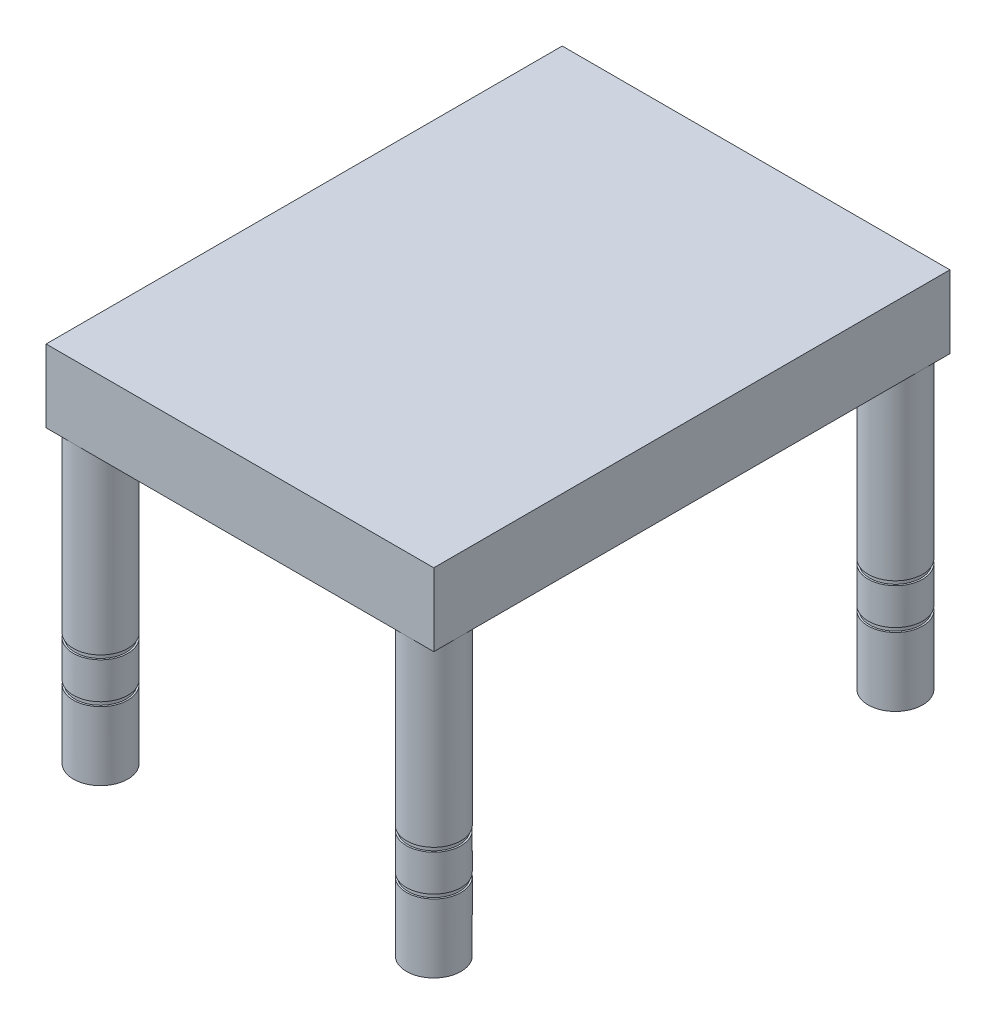
ISO-10303-21;
HEADER;
FILE_DESCRIPTION(('STEP AP214'),'2;1');
FILE_NAME('part.step','',(''),(''),'','','');
FILE_SCHEMA(('AUTOMOTIVE_DESIGN { 1 0 10303 214 1 1 1 1 }'));
ENDSEC;
DATA;
#1=APPLICATION_CONTEXT('core data for automotive mechanical design processes');
#2=APPLICATION_PROTOCOL_DEFINITION('international standard','automotive_design',2000,#1);
#3=PRODUCT_CONTEXT('',#1,'mechanical');
#4=PRODUCT('Part','Part','',(#3));
#5=PRODUCT_RELATED_PRODUCT_CATEGORY('part','',(#4));
#6=PRODUCT_DEFINITION_FORMATION('','',#4);
#7=PRODUCT_DEFINITION_CONTEXT('part definition',#1,'design');
#8=PRODUCT_DEFINITION('design','',#6,#7);
#9=PRODUCT_DEFINITION_SHAPE('','',#8);
#10=(LENGTH_UNIT() NAMED_UNIT(*) SI_UNIT(.MILLI.,.METRE.));
#11=(NAMED_UNIT(*) PLANE_ANGLE_UNIT() SI_UNIT($,.RADIAN.));
#12=(NAMED_UNIT(*) SI_UNIT($,.STERADIAN.) SOLID_ANGLE_UNIT());
#13=UNCERTAINTY_MEASURE_WITH_UNIT(LENGTH_MEASURE(1.E-05),#10,'distance_accuracy_value','');
#14=(GEOMETRIC_REPRESENTATION_CONTEXT(3) GLOBAL_UNCERTAINTY_ASSIGNED_CONTEXT((#13)) GLOBAL_UNIT_ASSIGNED_CONTEXT((#10,
#11,#12)) REPRESENTATION_CONTEXT('',''));
#15=CARTESIAN_POINT('',(0.,0.,0.));
#16=DIRECTION('',(0.,0.,1.));
#17=DIRECTION('',(1.,0.,0.));
#18=AXIS2_PLACEMENT_3D('',#15,#16,#17);
#19=CARTESIAN_POINT('',(0.,63.5,0.));
#20=DIRECTION('',(0.,1.,0.));
#21=DIRECTION('',(0.,0.,1.));
#22=AXIS2_PLACEMENT_3D('',#19,#20,#21);
#23=PLANE('',#22);
#24=DIRECTION('',(0.,0.,1.));
#25=VECTOR('',#24,1.);
#26=CARTESIAN_POINT('',(-33.8824951,63.5,-45.1092443));
#27=LINE('',#26,#25);
#28=CARTESIAN_POINT('',(-33.8824951,63.5,-45.1092443));
#29=VERTEX_POINT('',#28);
#30=CARTESIAN_POINT('',(-33.8824951,63.5,45.1092443));
#31=VERTEX_POINT('',#30);
#32=EDGE_CURVE('E159',#29,#31,#27,.T.);
#33=ORIENTED_EDGE('',*,*,#32,.T.);
#34=DIRECTION('',(1.,0.,0.));
#35=VECTOR('',#34,1.);
#36=CARTESIAN_POINT('',(-33.8824951,63.5,45.1092443));
#37=LINE('',#36,#35);
#38=CARTESIAN_POINT('',(33.882505006,63.5,45.1092443));
#39=VERTEX_POINT('',#38);
#40=EDGE_CURVE('E162',#31,#39,#37,.T.);
#41=ORIENTED_EDGE('',*,*,#40,.T.);
#42=DIRECTION('',(0.,0.,-1.));
#43=VECTOR('',#42,1.);
#44=CARTESIAN_POINT('',(33.882505006,63.5,-45.1092443));
#45=LINE('',#44,#43);
#46=CARTESIAN_POINT('',(33.882505006,63.5,-45.1092443));
#47=VERTEX_POINT('',#46);
#48=EDGE_CURVE('E165',#39,#47,#45,.T.);
#49=ORIENTED_EDGE('',*,*,#48,.T.);
#50=DIRECTION('',(-1.,0.,0.));
#51=VECTOR('',#50,1.);
#52=CARTESIAN_POINT('',(-33.8824951,63.5,-45.1092443));
#53=LINE('',#52,#51);
#54=EDGE_CURVE('E167',#47,#29,#53,.T.);
#55=ORIENTED_EDGE('',*,*,#54,.T.);
#56=EDGE_LOOP('',(#33,#41,#49,#55));
#57=FACE_BOUND('',#56,.T.);
#58=ADVANCED_FACE('F46',(#57),#23,.T.);
#59=CARTESIAN_POINT('',(-33.8824951,63.5,-45.1092443));
#60=DIRECTION('',(1.,0.,0.));
#61=DIRECTION('',(0.,0.,-1.));
#62=AXIS2_PLACEMENT_3D('',#59,#60,#61);
#63=PLANE('',#62);
#64=DIRECTION('',(0.,0.,1.));
#65=VECTOR('',#64,1.);
#66=CARTESIAN_POINT('',(-33.8824951,50.8,-45.1092443));
#67=LINE('',#66,#65);
#68=CARTESIAN_POINT('',(-33.8824951,50.8,-45.1092443));
#69=VERTEX_POINT('',#68);
#70=CARTESIAN_POINT('',(-33.8824951,50.8,-40.3467443));
#71=VERTEX_POINT('',#70);
#72=EDGE_CURVE('E169',#69,#71,#67,.T.);
#73=ORIENTED_EDGE('',*,*,#72,.T.);
#74=CARTESIAN_POINT('',(-33.8824951,50.8,40.3467443));
#75=VERTEX_POINT('',#74);
#76=EDGE_CURVE('E172',#71,#75,#67,.T.);
#77=ORIENTED_EDGE('',*,*,#76,.T.);
#78=CARTESIAN_POINT('',(-33.8824951,50.8,45.1092443));
#79=VERTEX_POINT('',#78);
#80=EDGE_CURVE('E173',#75,#79,#67,.T.);
#81=ORIENTED_EDGE('',*,*,#80,.T.);
#82=DIRECTION('',(0.,-1.,0.));
#83=VECTOR('',#82,1.);
#84=CARTESIAN_POINT('',(-33.8824951,63.5,45.1092443));
#85=LINE('',#84,#83);
#86=EDGE_CURVE('E182',#31,#79,#85,.T.);
#87=ORIENTED_EDGE('',*,*,#86,.F.);
#88=ORIENTED_EDGE('',*,*,#32,.F.);
#89=DIRECTION('',(0.,-1.,0.));
#90=VECTOR('',#89,1.);
#91=CARTESIAN_POINT('',(-33.8824951,63.5,-45.1092443));
#92=LINE('',#91,#90);
#93=EDGE_CURVE('E177',#29,#69,#92,.T.);
#94=ORIENTED_EDGE('',*,*,#93,.T.);
#95=EDGE_LOOP('',(#73,#77,#81,#87,#88,#94));
#96=FACE_BOUND('',#95,.T.);
#97=ADVANCED_FACE('F211',(#96),#63,.F.);
#98=CARTESIAN_POINT('',(-33.8824951,63.5,45.1092443));
#99=DIRECTION('',(0.,0.,-1.));
#100=DIRECTION('',(-1.,0.,0.));
#101=AXIS2_PLACEMENT_3D('',#98,#99,#100);
#102=PLANE('',#101);
#103=DIRECTION('',(1.,0.,0.));
#104=VECTOR('',#103,1.);
#105=CARTESIAN_POINT('',(-33.8824951,50.8,45.1092443));
#106=LINE('',#105,#104);
#107=CARTESIAN_POINT('',(-29.1199951,50.8,45.1092443));
#108=VERTEX_POINT('',#107);
#109=EDGE_CURVE('E174',#79,#108,#106,.T.);
#110=ORIENTED_EDGE('',*,*,#109,.T.);
#111=CARTESIAN_POINT('',(29.120005006,50.8,45.1092443));
#112=VERTEX_POINT('',#111);
#113=EDGE_CURVE('E176',#108,#112,#106,.T.);
#114=ORIENTED_EDGE('',*,*,#113,.T.);
#115=CARTESIAN_POINT('',(33.882505006,50.8,45.1092443));
#116=VERTEX_POINT('',#115);
#117=EDGE_CURVE('E178',#112,#116,#106,.T.);
#118=ORIENTED_EDGE('',*,*,#117,.T.);
#119=DIRECTION('',(0.,-1.,0.));
#120=VECTOR('',#119,1.);
#121=CARTESIAN_POINT('',(33.882505006,63.5,45.1092443));
#122=LINE('',#121,#120);
#123=EDGE_CURVE('E132',#39,#116,#122,.T.);
#124=ORIENTED_EDGE('',*,*,#123,.F.);
#125=ORIENTED_EDGE('',*,*,#40,.F.);
#126=ORIENTED_EDGE('',*,*,#86,.T.);
#127=EDGE_LOOP('',(#110,#114,#118,#124,#125,#126));
#128=FACE_BOUND('',#127,.T.);
#129=ADVANCED_FACE('F191',(#128),#102,.F.);
#130=CARTESIAN_POINT('',(33.882505006,63.5,-45.1092443));
#131=DIRECTION('',(-1.,0.,0.));
#132=DIRECTION('',(0.,0.,1.));
#133=AXIS2_PLACEMENT_3D('',#130,#131,#132);
#134=PLANE('',#133);
#135=DIRECTION('',(0.,0.,-1.));
#136=VECTOR('',#135,1.);
#137=CARTESIAN_POINT('',(33.882505006,50.8,-45.1092443));
#138=LINE('',#137,#136);
#139=CARTESIAN_POINT('',(33.882505006,50.8,40.3467443));
#140=VERTEX_POINT('',#139);
#141=EDGE_CURVE('E179',#116,#140,#138,.T.);
#142=ORIENTED_EDGE('',*,*,#141,.T.);
#143=CARTESIAN_POINT('',(33.882505006,50.8,-40.3467443));
#144=VERTEX_POINT('',#143);
#145=EDGE_CURVE('E181',#140,#144,#138,.T.);
#146=ORIENTED_EDGE('',*,*,#145,.T.);
#147=CARTESIAN_POINT('',(33.882505006,50.8,-45.1092443));
#148=VERTEX_POINT('',#147);
#149=EDGE_CURVE('E142',#144,#148,#138,.T.);
#150=ORIENTED_EDGE('',*,*,#149,.T.);
#151=DIRECTION('',(0.,-1.,0.));
#152=VECTOR('',#151,1.);
#153=CARTESIAN_POINT('',(33.882505006,63.5,-45.1092443));
#154=LINE('',#153,#152);
#155=EDGE_CURVE('E128',#47,#148,#154,.T.);
#156=ORIENTED_EDGE('',*,*,#155,.F.);
#157=ORIENTED_EDGE('',*,*,#48,.F.);
#158=ORIENTED_EDGE('',*,*,#123,.T.);
#159=EDGE_LOOP('',(#142,#146,#150,#156,#157,#158));
#160=FACE_BOUND('',#159,.T.);
#161=ADVANCED_FACE('F227',(#160),#134,.F.);
#162=CARTESIAN_POINT('',(-33.8824951,63.5,-45.1092443));
#163=DIRECTION('',(0.,0.,1.));
#164=DIRECTION('',(1.,0.,0.));
#165=AXIS2_PLACEMENT_3D('',#162,#163,#164);
#166=PLANE('',#165);
#167=DIRECTION('',(-1.,0.,0.));
#168=VECTOR('',#167,1.);
#169=CARTESIAN_POINT('',(-33.8824951,50.8,-45.1092443));
#170=LINE('',#169,#168);
#171=CARTESIAN_POINT('',(29.120005006,50.8,-45.1092443));
#172=VERTEX_POINT('',#171);
#173=EDGE_CURVE('E121',#148,#172,#170,.T.);
#174=ORIENTED_EDGE('',*,*,#173,.T.);
#175=CARTESIAN_POINT('',(-29.1199951,50.8,-45.1092443));
#176=VERTEX_POINT('',#175);
#177=EDGE_CURVE('E124',#172,#176,#170,.T.);
#178=ORIENTED_EDGE('',*,*,#177,.T.);
#179=EDGE_CURVE('E87',#176,#69,#170,.T.);
#180=ORIENTED_EDGE('',*,*,#179,.T.);
#181=ORIENTED_EDGE('',*,*,#93,.F.);
#182=ORIENTED_EDGE('',*,*,#54,.F.);
#183=ORIENTED_EDGE('',*,*,#155,.T.);
#184=EDGE_LOOP('',(#174,#178,#180,#181,#182,#183));
#185=FACE_BOUND('',#184,.T.);
#186=ADVANCED_FACE('F123',(#185),#166,.F.);
#187=CARTESIAN_POINT('',(0.,50.8,0.));
#188=DIRECTION('',(0.,1.,0.));
#189=DIRECTION('',(0.,0.,1.));
#190=AXIS2_PLACEMENT_3D('',#187,#188,#189);
#191=PLANE('',#190);
#192=ORIENTED_EDGE('',*,*,#179,.F.);
#193=CARTESIAN_POINT('',(-29.1199951,50.8,-40.3467443));
#194=DIRECTION('',(0.,1.,0.));
#195=DIRECTION('',(0.,0.,1.));
#196=AXIS2_PLACEMENT_3D('',#193,#194,#195);
#197=CIRCLE('',#196,4.7625);
#198=EDGE_CURVE('E50',#176,#71,#197,.T.);
#199=ORIENTED_EDGE('',*,*,#198,.T.);
#200=ORIENTED_EDGE('',*,*,#72,.F.);
#201=EDGE_LOOP('',(#192,#199,#200));
#202=FACE_BOUND('',#201,.T.);
#203=ADVANCED_FACE('F221',(#202),#191,.F.);
#204=CARTESIAN_POINT('',(-29.1199951,50.8,40.3467443));
#205=DIRECTION('',(0.,1.,0.));
#206=DIRECTION('',(0.,0.,1.));
#207=AXIS2_PLACEMENT_3D('',#204,#205,#206);
#208=CIRCLE('',#207,4.76250000000001);
#209=EDGE_CURVE('E157',#75,#108,#208,.T.);
#210=ORIENTED_EDGE('',*,*,#209,.T.);
#211=ORIENTED_EDGE('',*,*,#109,.F.);
#212=ORIENTED_EDGE('',*,*,#80,.F.);
#213=EDGE_LOOP('',(#210,#211,#212));
#214=FACE_BOUND('',#213,.T.);
#215=ADVANCED_FACE('F206',(#214),#191,.F.);
#216=CARTESIAN_POINT('',(29.120005006,50.8,40.3467443));
#217=DIRECTION('',(0.,1.,0.));
#218=DIRECTION('',(0.,0.,1.));
#219=AXIS2_PLACEMENT_3D('',#216,#217,#218);
#220=CIRCLE('',#219,4.7625);
#221=EDGE_CURVE('E77',#112,#140,#220,.T.);
#222=ORIENTED_EDGE('',*,*,#221,.T.);
#223=ORIENTED_EDGE('',*,*,#141,.F.);
#224=ORIENTED_EDGE('',*,*,#117,.F.);
#225=EDGE_LOOP('',(#222,#223,#224));
#226=FACE_BOUND('',#225,.T.);
#227=ADVANCED_FACE('F194',(#226),#191,.F.);
#228=CARTESIAN_POINT('',(-29.1199951,50.8,-40.3467443));
#229=DIRECTION('',(0.,-1.,0.));
#230=DIRECTION('',(0.,0.,-1.));
#231=AXIS2_PLACEMENT_3D('',#228,#229,#230);
#232=CYLINDRICAL_SURFACE('',#231,4.7625);
#233=CARTESIAN_POINT('',(-29.1199951,19.7866,-40.3467443));
#234=DIRECTION('',(0.,1.,0.));
#235=DIRECTION('',(0.,0.,1.));
#236=AXIS2_PLACEMENT_3D('',#233,#234,#235);
#237=CIRCLE('',#236,4.7625);
#238=CARTESIAN_POINT('',(-29.1199951,19.7866,-35.5842443));
#239=VERTEX_POINT('',#238);
#240=EDGE_CURVE('E156',#239,#239,#237,.T.);
#241=ORIENTED_EDGE('',*,*,#240,.T.);
#242=EDGE_LOOP('',(#241));
#243=FACE_BOUND('',#242,.T.);
#244=ORIENTED_EDGE('',*,*,#198,.F.);
#245=EDGE_CURVE('E138',#71,#176,#197,.T.);
#246=ORIENTED_EDGE('',*,*,#245,.F.);
#247=EDGE_LOOP('',(#244,#246));
#248=FACE_BOUND('',#247,.T.);
#249=ADVANCED_FACE('F207',(#243,#248),#232,.T.);
#250=CARTESIAN_POINT('',(-29.1199951,50.8,40.3467443));
#251=DIRECTION('',(0.,-1.,0.));
#252=DIRECTION('',(0.,0.,-1.));
#253=AXIS2_PLACEMENT_3D('',#250,#251,#252);
#254=CYLINDRICAL_SURFACE('',#253,4.76250000000001);
#255=CARTESIAN_POINT('',(-29.1199951,19.7866,40.3467443));
#256=DIRECTION('',(0.,1.,0.));
#257=DIRECTION('',(0.,0.,1.));
#258=AXIS2_PLACEMENT_3D('',#255,#256,#257);
#259=CIRCLE('',#258,4.76250000000001);
#260=CARTESIAN_POINT('',(-29.1199951,19.7866,45.1092443));
#261=VERTEX_POINT('',#260);
#262=EDGE_CURVE('E152',#261,#261,#259,.T.);
#263=ORIENTED_EDGE('',*,*,#262,.T.);
#264=EDGE_LOOP('',(#263));
#265=FACE_BOUND('',#264,.T.);
#266=EDGE_CURVE('E64',#108,#75,#208,.T.);
#267=ORIENTED_EDGE('',*,*,#266,.F.);
#268=ORIENTED_EDGE('',*,*,#209,.F.);
#269=EDGE_LOOP('',(#267,#268));
#270=FACE_BOUND('',#269,.T.);
#271=ADVANCED_FACE('F199',(#265,#270),#254,.T.);
#272=CARTESIAN_POINT('',(29.120005006,50.8,40.3467443));
#273=DIRECTION('',(0.,-1.,0.));
#274=DIRECTION('',(0.,0.,-1.));
#275=AXIS2_PLACEMENT_3D('',#272,#273,#274);
#276=CYLINDRICAL_SURFACE('',#275,4.7625);
#277=CARTESIAN_POINT('',(29.120005006,19.7866,40.3467443));
#278=DIRECTION('',(0.,1.,0.));
#279=DIRECTION('',(0.,0.,1.));
#280=AXIS2_PLACEMENT_3D('',#277,#278,#279);
#281=CIRCLE('',#280,4.7625);
#282=CARTESIAN_POINT('',(29.120005006,19.7866,45.1092443));
#283=VERTEX_POINT('',#282);
#284=EDGE_CURVE('E148',#283,#283,#281,.T.);
#285=ORIENTED_EDGE('',*,*,#284,.T.);
#286=EDGE_LOOP('',(#285));
#287=FACE_BOUND('',#286,.T.);
#288=ORIENTED_EDGE('',*,*,#221,.F.);
#289=EDGE_CURVE('E147',#140,#112,#220,.T.);
#290=ORIENTED_EDGE('',*,*,#289,.F.);
#291=EDGE_LOOP('',(#288,#290));
#292=FACE_BOUND('',#291,.T.);
#293=ADVANCED_FACE('F197',(#287,#292),#276,.T.);
#294=CARTESIAN_POINT('',(29.120005006,50.8,-40.3467443));
#295=DIRECTION('',(0.,1.,0.));
#296=DIRECTION('',(0.,0.,1.));
#297=AXIS2_PLACEMENT_3D('',#294,#295,#296);
#298=CIRCLE('',#297,4.7625);
#299=EDGE_CURVE('E137',#172,#144,#298,.T.);
#300=ORIENTED_EDGE('',*,*,#299,.T.);
#301=ORIENTED_EDGE('',*,*,#145,.F.);
#302=ORIENTED_EDGE('',*,*,#289,.T.);
#303=ORIENTED_EDGE('',*,*,#113,.F.);
#304=ORIENTED_EDGE('',*,*,#266,.T.);
#305=ORIENTED_EDGE('',*,*,#76,.F.);
#306=ORIENTED_EDGE('',*,*,#245,.T.);
#307=ORIENTED_EDGE('',*,*,#177,.F.);
#308=EDGE_LOOP('',(#300,#301,#302,#303,#304,#305,#306,#307));
#309=FACE_BOUND('',#308,.T.);
#310=ADVANCED_FACE('F135',(#309),#191,.F.);
#311=EDGE_CURVE('E140',#144,#172,#298,.T.);
#312=ORIENTED_EDGE('',*,*,#311,.T.);
#313=ORIENTED_EDGE('',*,*,#173,.F.);
#314=ORIENTED_EDGE('',*,*,#149,.F.);
#315=EDGE_LOOP('',(#312,#313,#314));
#316=FACE_BOUND('',#315,.T.);
#317=ADVANCED_FACE('F141',(#316),#191,.F.);
#318=CARTESIAN_POINT('',(29.120005006,50.8,-40.3467443));
#319=DIRECTION('',(0.,-1.,0.));
#320=DIRECTION('',(0.,0.,-1.));
#321=AXIS2_PLACEMENT_3D('',#318,#319,#320);
#322=CYLINDRICAL_SURFACE('',#321,4.7625);
#323=CARTESIAN_POINT('',(29.120005006,19.7866,-40.3467443));
#324=DIRECTION('',(0.,1.,0.));
#325=DIRECTION('',(0.,0.,1.));
#326=AXIS2_PLACEMENT_3D('',#323,#324,#325);
#327=CIRCLE('',#326,4.7625);
#328=CARTESIAN_POINT('',(29.120005006,19.7866,-35.5842443));
#329=VERTEX_POINT('',#328);
#330=EDGE_CURVE('E145',#329,#329,#327,.T.);
#331=ORIENTED_EDGE('',*,*,#330,.T.);
#332=EDGE_LOOP('',(#331));
#333=FACE_BOUND('',#332,.T.);
#334=ORIENTED_EDGE('',*,*,#311,.F.);
#335=ORIENTED_EDGE('',*,*,#299,.F.);
#336=EDGE_LOOP('',(#334,#335));
#337=FACE_BOUND('',#336,.T.);
#338=ADVANCED_FACE('F48',(#333,#337),#322,.T.);
#339=CARTESIAN_POINT('',(0.,19.7866,0.));
#340=DIRECTION('',(0.,1.,0.));
#341=DIRECTION('',(0.,0.,1.));
#342=AXIS2_PLACEMENT_3D('',#339,#340,#341);
#343=PLANE('',#342);
#344=CARTESIAN_POINT('',(29.120005006,19.7866,-40.3467443));
#345=DIRECTION('',(0.,-1.,0.));
#346=DIRECTION('',(0.,0.,-1.));
#347=AXIS2_PLACEMENT_3D('',#344,#345,#346);
#348=CIRCLE('',#347,4.4704);
#349=CARTESIAN_POINT('',(29.120005006,19.7866,-44.8171443));
#350=VERTEX_POINT('',#349);
#351=EDGE_CURVE('E56',#350,#350,#348,.T.);
#352=ORIENTED_EDGE('',*,*,#351,.F.);
#353=EDGE_LOOP('',(#352));
#354=FACE_BOUND('',#353,.T.);
#355=ORIENTED_EDGE('',*,*,#330,.F.);
#356=EDGE_LOOP('',(#355));
#357=FACE_BOUND('',#356,.T.);
#358=ADVANCED_FACE('F243',(#354,#357),#343,.F.);
#359=CARTESIAN_POINT('',(0.,19.7866,0.));
#360=DIRECTION('',(0.,1.,0.));
#361=DIRECTION('',(0.,0.,1.));
#362=AXIS2_PLACEMENT_3D('',#359,#360,#361);
#363=PLANE('',#362);
#364=CARTESIAN_POINT('',(29.120005006,19.7866,40.3467443));
#365=DIRECTION('',(0.,-1.,0.));
#366=DIRECTION('',(0.,0.,-1.));
#367=AXIS2_PLACEMENT_3D('',#364,#365,#366);
#368=CIRCLE('',#367,4.4704);
#369=CARTESIAN_POINT('',(29.120005006,19.7866,35.8763443));
#370=VERTEX_POINT('',#369);
#371=EDGE_CURVE('E254',#370,#370,#368,.T.);
#372=ORIENTED_EDGE('',*,*,#371,.F.);
#373=EDGE_LOOP('',(#372));
#374=FACE_BOUND('',#373,.T.);
#375=ORIENTED_EDGE('',*,*,#284,.F.);
#376=EDGE_LOOP('',(#375));
#377=FACE_BOUND('',#376,.T.);
#378=ADVANCED_FACE('F237',(#374,#377),#363,.F.);
#379=CARTESIAN_POINT('',(0.,19.7866,0.));
#380=DIRECTION('',(0.,1.,0.));
#381=DIRECTION('',(0.,0.,1.));
#382=AXIS2_PLACEMENT_3D('',#379,#380,#381);
#383=PLANE('',#382);
#384=CARTESIAN_POINT('',(-29.1199951,19.7866,40.3467443));
#385=DIRECTION('',(0.,-1.,0.));
#386=DIRECTION('',(0.,0.,-1.));
#387=AXIS2_PLACEMENT_3D('',#384,#385,#386);
#388=CIRCLE('',#387,4.4704);
#389=CARTESIAN_POINT('',(-29.1199951,19.7866,35.8763443));
#390=VERTEX_POINT('',#389);
#391=EDGE_CURVE('E257',#390,#390,#388,.T.);
#392=ORIENTED_EDGE('',*,*,#391,.F.);
#393=EDGE_LOOP('',(#392));
#394=FACE_BOUND('',#393,.T.);
#395=ORIENTED_EDGE('',*,*,#262,.F.);
#396=EDGE_LOOP('',(#395));
#397=FACE_BOUND('',#396,.T.);
#398=ADVANCED_FACE('F233',(#394,#397),#383,.F.);
#399=CARTESIAN_POINT('',(0.,19.7866,0.));
#400=DIRECTION('',(0.,1.,0.));
#401=DIRECTION('',(0.,0.,1.));
#402=AXIS2_PLACEMENT_3D('',#399,#400,#401);
#403=PLANE('',#402);
#404=CARTESIAN_POINT('',(-29.1199951,19.7866,-40.3467443));
#405=DIRECTION('',(0.,-1.,0.));
#406=DIRECTION('',(0.,0.,-1.));
#407=AXIS2_PLACEMENT_3D('',#404,#405,#406);
#408=CIRCLE('',#407,4.4704);
#409=CARTESIAN_POINT('',(-29.1199951,19.7866,-44.8171443));
#410=VERTEX_POINT('',#409);
#411=EDGE_CURVE('E12',#410,#410,#408,.T.);
#412=ORIENTED_EDGE('',*,*,#411,.F.);
#413=EDGE_LOOP('',(#412));
#414=FACE_BOUND('',#413,.T.);
#415=ORIENTED_EDGE('',*,*,#240,.F.);
#416=EDGE_LOOP('',(#415));
#417=FACE_BOUND('',#416,.T.);
#418=ADVANCED_FACE('F236',(#414,#417),#403,.F.);
#419=CARTESIAN_POINT('',(-29.1199951,6.40579938153461,40.3467443));
#420=DIRECTION('',(0.,1.,0.));
#421=DIRECTION('',(0.,0.,1.));
#422=AXIS2_PLACEMENT_3D('',#419,#420,#421);
#423=CYLINDRICAL_SURFACE('',#422,4.4704);
#424=CARTESIAN_POINT('',(-29.1199951,19.05,40.3467443));
#425=DIRECTION('',(0.,1.,0.));
#426=DIRECTION('',(0.,0.,1.));
#427=AXIS2_PLACEMENT_3D('',#424,#425,#426);
#428=CIRCLE('',#427,4.4704);
#429=CARTESIAN_POINT('',(-29.1199951,19.05,44.8171443));
#430=VERTEX_POINT('',#429);
#431=EDGE_CURVE('E163',#430,#430,#428,.T.);
#432=ORIENTED_EDGE('',*,*,#431,.T.);
#433=EDGE_LOOP('',(#432));
#434=FACE_BOUND('',#433,.T.);
#435=ORIENTED_EDGE('',*,*,#391,.T.);
#436=EDGE_LOOP('',(#435));
#437=FACE_BOUND('',#436,.T.);
#438=ADVANCED_FACE('F241',(#434,#437),#423,.T.);
#439=CARTESIAN_POINT('',(-29.1199951,0.,40.3467443));
#440=DIRECTION('',(0.,1.,0.));
#441=DIRECTION('',(0.,0.,1.));
#442=AXIS2_PLACEMENT_3D('',#439,#440,#441);
#443=PLANE('',#442);
#444=CARTESIAN_POINT('',(-29.1199951,0.,40.3467443));
#445=DIRECTION('',(0.,1.,0.));
#446=DIRECTION('',(0.,0.,1.));
#447=AXIS2_PLACEMENT_3D('',#444,#445,#446);
#448=CIRCLE('',#447,4.76250000000001);
#449=CARTESIAN_POINT('',(-29.1199951,0.,45.1092443));
#450=VERTEX_POINT('',#449);
#451=EDGE_CURVE('E272',#450,#450,#448,.T.);
#452=ORIENTED_EDGE('',*,*,#451,.F.);
#453=EDGE_LOOP('',(#452));
#454=FACE_BOUND('',#453,.T.);
#455=ADVANCED_FACE('F378',(#454),#443,.F.);
#456=CARTESIAN_POINT('',(-29.1199951,50.8,40.3467443));
#457=DIRECTION('',(0.,-1.,0.));
#458=DIRECTION('',(0.,0.,-1.));
#459=AXIS2_PLACEMENT_3D('',#456,#457,#458);
#460=CYLINDRICAL_SURFACE('',#459,4.76250000000001);
#461=CARTESIAN_POINT('',(-29.1199951,11.9634,40.3467443));
#462=DIRECTION('',(0.,-1.,0.));
#463=DIRECTION('',(0.,0.,-1.));
#464=AXIS2_PLACEMENT_3D('',#461,#462,#463);
#465=CIRCLE('',#464,4.7625);
#466=CARTESIAN_POINT('',(-29.1199951,11.9634,35.5842443));
#467=VERTEX_POINT('',#466);
#468=EDGE_CURVE('E276',#467,#467,#465,.T.);
#469=ORIENTED_EDGE('',*,*,#468,.T.);
#470=EDGE_LOOP('',(#469));
#471=FACE_BOUND('',#470,.T.);
#472=ORIENTED_EDGE('',*,*,#451,.T.);
#473=EDGE_LOOP('',(#472));
#474=FACE_BOUND('',#473,.T.);
#475=ADVANCED_FACE('F388',(#471,#474),#460,.T.);
#476=CARTESIAN_POINT('',(0.,11.9634,0.));
#477=DIRECTION('',(0.,-1.,0.));
#478=DIRECTION('',(0.,0.,-1.));
#479=AXIS2_PLACEMENT_3D('',#476,#477,#478);
#480=PLANE('',#479);
#481=CARTESIAN_POINT('',(-29.1199951,11.9634,40.3467443));
#482=DIRECTION('',(0.,-1.,0.));
#483=DIRECTION('',(0.,0.,-1.));
#484=AXIS2_PLACEMENT_3D('',#481,#482,#483);
#485=CIRCLE('',#484,4.4704);
#486=CARTESIAN_POINT('',(-29.1199951,11.9634,35.8763443));
#487=VERTEX_POINT('',#486);
#488=EDGE_CURVE('E275',#487,#487,#485,.T.);
#489=ORIENTED_EDGE('',*,*,#488,.T.);
#490=EDGE_LOOP('',(#489));
#491=FACE_BOUND('',#490,.T.);
#492=ORIENTED_EDGE('',*,*,#468,.F.);
#493=EDGE_LOOP('',(#492));
#494=FACE_BOUND('',#493,.T.);
#495=ADVANCED_FACE('F398',(#491,#494),#480,.F.);
#496=CARTESIAN_POINT('',(-29.1199951,-0.680800618465373,40.3467443));
#497=DIRECTION('',(0.,1.,0.));
#498=DIRECTION('',(0.,0.,1.));
#499=AXIS2_PLACEMENT_3D('',#496,#497,#498);
#500=CYLINDRICAL_SURFACE('',#499,4.4704);
#501=CARTESIAN_POINT('',(-29.1199951,12.7,40.3467443));
#502=DIRECTION('',(0.,-1.,0.));
#503=DIRECTION('',(0.,0.,-1.));
#504=AXIS2_PLACEMENT_3D('',#501,#502,#503);
#505=CIRCLE('',#504,4.4704);
#506=CARTESIAN_POINT('',(-29.1199951,12.7,35.8763443));
#507=VERTEX_POINT('',#506);
#508=EDGE_CURVE('E279',#507,#507,#505,.T.);
#509=ORIENTED_EDGE('',*,*,#508,.T.);
#510=EDGE_LOOP('',(#509));
#511=FACE_BOUND('',#510,.T.);
#512=ORIENTED_EDGE('',*,*,#488,.F.);
#513=EDGE_LOOP('',(#512));
#514=FACE_BOUND('',#513,.T.);
#515=ADVANCED_FACE('F408',(#511,#514),#500,.T.);
#516=CARTESIAN_POINT('',(0.,12.7,0.));
#517=DIRECTION('',(0.,-1.,0.));
#518=DIRECTION('',(0.,0.,-1.));
#519=AXIS2_PLACEMENT_3D('',#516,#517,#518);
#520=PLANE('',#519);
#521=ORIENTED_EDGE('',*,*,#508,.F.);
#522=EDGE_LOOP('',(#521));
#523=FACE_BOUND('',#522,.T.);
#524=CARTESIAN_POINT('',(-29.1199951,12.7,40.3467443));
#525=DIRECTION('',(0.,-1.,0.));
#526=DIRECTION('',(0.,0.,-1.));
#527=AXIS2_PLACEMENT_3D('',#524,#525,#526);
#528=CIRCLE('',#527,4.7625);
#529=CARTESIAN_POINT('',(-29.1199951,12.7,35.5842443));
#530=VERTEX_POINT('',#529);
#531=EDGE_CURVE('E282',#530,#530,#528,.T.);
#532=ORIENTED_EDGE('',*,*,#531,.T.);
#533=EDGE_LOOP('',(#532));
#534=FACE_BOUND('',#533,.T.);
#535=ADVANCED_FACE('F418',(#523,#534),#520,.T.);
#536=CARTESIAN_POINT('',(-29.1199951,50.8,40.3467443));
#537=DIRECTION('',(0.,-1.,0.));
#538=DIRECTION('',(0.,0.,-1.));
#539=AXIS2_PLACEMENT_3D('',#536,#537,#538);
#540=CYLINDRICAL_SURFACE('',#539,4.76250000000001);
#541=ORIENTED_EDGE('',*,*,#531,.F.);
#542=EDGE_LOOP('',(#541));
#543=FACE_BOUND('',#542,.T.);
#544=CARTESIAN_POINT('',(-29.1199951,19.05,40.3467443));
#545=DIRECTION('',(0.,1.,0.));
#546=DIRECTION('',(0.,0.,1.));
#547=AXIS2_PLACEMENT_3D('',#544,#545,#546);
#548=CIRCLE('',#547,4.76250000000001);
#549=CARTESIAN_POINT('',(-29.1199951,19.05,45.1092443));
#550=VERTEX_POINT('',#549);
#551=EDGE_CURVE('E270',#550,#550,#548,.T.);
#552=ORIENTED_EDGE('',*,*,#551,.F.);
#553=EDGE_LOOP('',(#552));
#554=FACE_BOUND('',#553,.T.);
#555=ADVANCED_FACE('F428',(#543,#554),#540,.T.);
#556=CARTESIAN_POINT('',(0.,19.05,0.));
#557=DIRECTION('',(0.,1.,0.));
#558=DIRECTION('',(0.,0.,1.));
#559=AXIS2_PLACEMENT_3D('',#556,#557,#558);
#560=PLANE('',#559);
#561=ORIENTED_EDGE('',*,*,#431,.F.);
#562=EDGE_LOOP('',(#561));
#563=FACE_BOUND('',#562,.T.);
#564=ORIENTED_EDGE('',*,*,#551,.T.);
#565=EDGE_LOOP('',(#564));
#566=FACE_BOUND('',#565,.T.);
#567=ADVANCED_FACE('F438',(#563,#566),#560,.T.);
#568=CARTESIAN_POINT('',(29.120005006,6.40579938153461,40.3467443));
#569=DIRECTION('',(0.,1.,0.));
#570=DIRECTION('',(0.,0.,1.));
#571=AXIS2_PLACEMENT_3D('',#568,#569,#570);
#572=CYLINDRICAL_SURFACE('',#571,4.4704);
#573=CARTESIAN_POINT('',(29.120005006,19.05,40.3467443));
#574=DIRECTION('',(0.,1.,0.));
#575=DIRECTION('',(0.,0.,1.));
#576=AXIS2_PLACEMENT_3D('',#573,#574,#575);
#577=CIRCLE('',#576,4.4704);
#578=CARTESIAN_POINT('',(29.120005006,19.05,44.8171443));
#579=VERTEX_POINT('',#578);
#580=EDGE_CURVE('E267',#579,#579,#577,.T.);
#581=ORIENTED_EDGE('',*,*,#580,.T.);
#582=EDGE_LOOP('',(#581));
#583=FACE_BOUND('',#582,.T.);
#584=ORIENTED_EDGE('',*,*,#371,.T.);
#585=EDGE_LOOP('',(#584));
#586=FACE_BOUND('',#585,.T.);
#587=ADVANCED_FACE('F448',(#583,#586),#572,.T.);
#588=CARTESIAN_POINT('',(29.120005006,0.,40.3467443));
#589=DIRECTION('',(0.,1.,0.));
#590=DIRECTION('',(0.,0.,1.));
#591=AXIS2_PLACEMENT_3D('',#588,#589,#590);
#592=PLANE('',#591);
#593=CARTESIAN_POINT('',(29.120005006,0.,40.3467443));
#594=DIRECTION('',(0.,1.,0.));
#595=DIRECTION('',(0.,0.,1.));
#596=AXIS2_PLACEMENT_3D('',#593,#594,#595);
#597=CIRCLE('',#596,4.7625);
#598=CARTESIAN_POINT('',(29.120005006,0.,45.1092443));
#599=VERTEX_POINT('',#598);
#600=EDGE_CURVE('E265',#599,#599,#597,.T.);
#601=ORIENTED_EDGE('',*,*,#600,.F.);
#602=EDGE_LOOP('',(#601));
#603=FACE_BOUND('',#602,.T.);
#604=ADVANCED_FACE('F458',(#603),#592,.F.);
#605=CARTESIAN_POINT('',(29.120005006,50.8,40.3467443));
#606=DIRECTION('',(0.,-1.,0.));
#607=DIRECTION('',(0.,0.,-1.));
#608=AXIS2_PLACEMENT_3D('',#605,#606,#607);
#609=CYLINDRICAL_SURFACE('',#608,4.7625);
#610=CARTESIAN_POINT('',(29.120005006,11.9634,40.3467443));
#611=DIRECTION('',(0.,-1.,0.));
#612=DIRECTION('',(0.,0.,-1.));
#613=AXIS2_PLACEMENT_3D('',#610,#611,#612);
#614=CIRCLE('',#613,4.7625);
#615=CARTESIAN_POINT('',(29.120005006,11.9634,35.5842443));
#616=VERTEX_POINT('',#615);
#617=EDGE_CURVE('E737',#616,#616,#614,.T.);
#618=ORIENTED_EDGE('',*,*,#617,.T.);
#619=EDGE_LOOP('',(#618));
#620=FACE_BOUND('',#619,.T.);
#621=ORIENTED_EDGE('',*,*,#600,.T.);
#622=EDGE_LOOP('',(#621));
#623=FACE_BOUND('',#622,.T.);
#624=ADVANCED_FACE('F468',(#620,#623),#609,.T.);
#625=CARTESIAN_POINT('',(0.,11.9634,0.));
#626=DIRECTION('',(0.,-1.,0.));
#627=DIRECTION('',(0.,0.,-1.));
#628=AXIS2_PLACEMENT_3D('',#625,#626,#627);
#629=PLANE('',#628);
#630=CARTESIAN_POINT('',(29.120005006,11.9634,40.3467443));
#631=DIRECTION('',(0.,-1.,0.));
#632=DIRECTION('',(0.,0.,-1.));
#633=AXIS2_PLACEMENT_3D('',#630,#631,#632);
#634=CIRCLE('',#633,4.4704);
#635=CARTESIAN_POINT('',(29.120005006,11.9634,35.8763443));
#636=VERTEX_POINT('',#635);
#637=EDGE_CURVE('E744',#636,#636,#634,.T.);
#638=ORIENTED_EDGE('',*,*,#637,.T.);
#639=EDGE_LOOP('',(#638));
#640=FACE_BOUND('',#639,.T.);
#641=ORIENTED_EDGE('',*,*,#617,.F.);
#642=EDGE_LOOP('',(#641));
#643=FACE_BOUND('',#642,.T.);
#644=ADVANCED_FACE('F478',(#640,#643),#629,.F.);
#645=CARTESIAN_POINT('',(29.120005006,-0.680800618465373,40.3467443));
#646=DIRECTION('',(0.,1.,0.));
#647=DIRECTION('',(0.,0.,1.));
#648=AXIS2_PLACEMENT_3D('',#645,#646,#647);
#649=CYLINDRICAL_SURFACE('',#648,4.4704);
#650=CARTESIAN_POINT('',(29.120005006,12.7,40.3467443));
#651=DIRECTION('',(0.,-1.,0.));
#652=DIRECTION('',(0.,0.,-1.));
#653=AXIS2_PLACEMENT_3D('',#650,#651,#652);
#654=CIRCLE('',#653,4.4704);
#655=CARTESIAN_POINT('',(29.120005006,12.7,35.8763443));
#656=VERTEX_POINT('',#655);
#657=EDGE_CURVE('E743',#656,#656,#654,.T.);
#658=ORIENTED_EDGE('',*,*,#657,.T.);
#659=EDGE_LOOP('',(#658));
#660=FACE_BOUND('',#659,.T.);
#661=ORIENTED_EDGE('',*,*,#637,.F.);
#662=EDGE_LOOP('',(#661));
#663=FACE_BOUND('',#662,.T.);
#664=ADVANCED_FACE('F488',(#660,#663),#649,.T.);
#665=CARTESIAN_POINT('',(0.,12.7,0.));
#666=DIRECTION('',(0.,-1.,0.));
#667=DIRECTION('',(0.,0.,-1.));
#668=AXIS2_PLACEMENT_3D('',#665,#666,#667);
#669=PLANE('',#668);
#670=ORIENTED_EDGE('',*,*,#657,.F.);
#671=EDGE_LOOP('',(#670));
#672=FACE_BOUND('',#671,.T.);
#673=CARTESIAN_POINT('',(29.120005006,12.7,40.3467443));
#674=DIRECTION('',(0.,-1.,0.));
#675=DIRECTION('',(0.,0.,-1.));
#676=AXIS2_PLACEMENT_3D('',#673,#674,#675);
#677=CIRCLE('',#676,4.7625);
#678=CARTESIAN_POINT('',(29.120005006,12.7,35.5842443));
#679=VERTEX_POINT('',#678);
#680=EDGE_CURVE('E740',#679,#679,#677,.T.);
#681=ORIENTED_EDGE('',*,*,#680,.T.);
#682=EDGE_LOOP('',(#681));
#683=FACE_BOUND('',#682,.T.);
#684=ADVANCED_FACE('F498',(#672,#683),#669,.T.);
#685=CARTESIAN_POINT('',(29.120005006,50.8,40.3467443));
#686=DIRECTION('',(0.,-1.,0.));
#687=DIRECTION('',(0.,0.,-1.));
#688=AXIS2_PLACEMENT_3D('',#685,#686,#687);
#689=CYLINDRICAL_SURFACE('',#688,4.7625);
#690=ORIENTED_EDGE('',*,*,#680,.F.);
#691=EDGE_LOOP('',(#690));
#692=FACE_BOUND('',#691,.T.);
#693=CARTESIAN_POINT('',(29.120005006,19.05,40.3467443));
#694=DIRECTION('',(0.,1.,0.));
#695=DIRECTION('',(0.,0.,1.));
#696=AXIS2_PLACEMENT_3D('',#693,#694,#695);
#697=CIRCLE('',#696,4.7625);
#698=CARTESIAN_POINT('',(29.120005006,19.05,45.1092443));
#699=VERTEX_POINT('',#698);
#700=EDGE_CURVE('E271',#699,#699,#697,.T.);
#701=ORIENTED_EDGE('',*,*,#700,.F.);
#702=EDGE_LOOP('',(#701));
#703=FACE_BOUND('',#702,.T.);
#704=ADVANCED_FACE('F508',(#692,#703),#689,.T.);
#705=CARTESIAN_POINT('',(0.,19.05,0.));
#706=DIRECTION('',(0.,1.,0.));
#707=DIRECTION('',(0.,0.,1.));
#708=AXIS2_PLACEMENT_3D('',#705,#706,#707);
#709=PLANE('',#708);
#710=ORIENTED_EDGE('',*,*,#580,.F.);
#711=EDGE_LOOP('',(#710));
#712=FACE_BOUND('',#711,.T.);
#713=ORIENTED_EDGE('',*,*,#700,.T.);
#714=EDGE_LOOP('',(#713));
#715=FACE_BOUND('',#714,.T.);
#716=ADVANCED_FACE('F518',(#712,#715),#709,.T.);
#717=CARTESIAN_POINT('',(29.120005006,6.40579938153461,-40.3467443));
#718=DIRECTION('',(0.,1.,0.));
#719=DIRECTION('',(0.,0.,1.));
#720=AXIS2_PLACEMENT_3D('',#717,#718,#719);
#721=CYLINDRICAL_SURFACE('',#720,4.4704);
#722=CARTESIAN_POINT('',(29.120005006,19.05,-40.3467443));
#723=DIRECTION('',(0.,1.,0.));
#724=DIRECTION('',(0.,0.,1.));
#725=AXIS2_PLACEMENT_3D('',#722,#723,#724);
#726=CIRCLE('',#725,4.4704);
#727=CARTESIAN_POINT('',(29.120005006,19.05,-35.8763443));
#728=VERTEX_POINT('',#727);
#729=EDGE_CURVE('E720',#728,#728,#726,.T.);
#730=ORIENTED_EDGE('',*,*,#729,.T.);
#731=EDGE_LOOP('',(#730));
#732=FACE_BOUND('',#731,.T.);
#733=ORIENTED_EDGE('',*,*,#351,.T.);
#734=EDGE_LOOP('',(#733));
#735=FACE_BOUND('',#734,.T.);
#736=ADVANCED_FACE('F528',(#732,#735),#721,.T.);
#737=CARTESIAN_POINT('',(29.120005006,0.,-40.3467443));
#738=DIRECTION('',(0.,1.,0.));
#739=DIRECTION('',(0.,0.,1.));
#740=AXIS2_PLACEMENT_3D('',#737,#738,#739);
#741=PLANE('',#740);
#742=CARTESIAN_POINT('',(29.120005006,0.,-40.3467443));
#743=DIRECTION('',(0.,1.,0.));
#744=DIRECTION('',(0.,0.,1.));
#745=AXIS2_PLACEMENT_3D('',#742,#743,#744);
#746=CIRCLE('',#745,4.7625);
#747=CARTESIAN_POINT('',(29.120005006,0.,-35.5842443));
#748=VERTEX_POINT('',#747);
#749=EDGE_CURVE('E728',#748,#748,#746,.T.);
#750=ORIENTED_EDGE('',*,*,#749,.F.);
#751=EDGE_LOOP('',(#750));
#752=FACE_BOUND('',#751,.T.);
#753=ADVANCED_FACE('F538',(#752),#741,.F.);
#754=CARTESIAN_POINT('',(29.120005006,50.8,-40.3467443));
#755=DIRECTION('',(0.,-1.,0.));
#756=DIRECTION('',(0.,0.,-1.));
#757=AXIS2_PLACEMENT_3D('',#754,#755,#756);
#758=CYLINDRICAL_SURFACE('',#757,4.7625);
#759=CARTESIAN_POINT('',(29.120005006,11.9634,-40.3467443));
#760=DIRECTION('',(0.,-1.,0.));
#761=DIRECTION('',(0.,0.,-1.));
#762=AXIS2_PLACEMENT_3D('',#759,#760,#761);
#763=CIRCLE('',#762,4.7625);
#764=CARTESIAN_POINT('',(29.120005006,11.9634,-45.1092443));
#765=VERTEX_POINT('',#764);
#766=EDGE_CURVE('E700',#765,#765,#763,.T.);
#767=ORIENTED_EDGE('',*,*,#766,.T.);
#768=EDGE_LOOP('',(#767));
#769=FACE_BOUND('',#768,.T.);
#770=ORIENTED_EDGE('',*,*,#749,.T.);
#771=EDGE_LOOP('',(#770));
#772=FACE_BOUND('',#771,.T.);
#773=ADVANCED_FACE('F548',(#769,#772),#758,.T.);
#774=CARTESIAN_POINT('',(0.,11.9634,0.));
#775=DIRECTION('',(0.,-1.,0.));
#776=DIRECTION('',(0.,0.,-1.));
#777=AXIS2_PLACEMENT_3D('',#774,#775,#776);
#778=PLANE('',#777);
#779=CARTESIAN_POINT('',(29.120005006,11.9634,-40.3467443));
#780=DIRECTION('',(0.,-1.,0.));
#781=DIRECTION('',(0.,0.,-1.));
#782=AXIS2_PLACEMENT_3D('',#779,#780,#781);
#783=CIRCLE('',#782,4.4704);
#784=CARTESIAN_POINT('',(29.120005006,11.9634,-44.8171443));
#785=VERTEX_POINT('',#784);
#786=EDGE_CURVE('E725',#785,#785,#783,.T.);
#787=ORIENTED_EDGE('',*,*,#786,.T.);
#788=EDGE_LOOP('',(#787));
#789=FACE_BOUND('',#788,.T.);
#790=ORIENTED_EDGE('',*,*,#766,.F.);
#791=EDGE_LOOP('',(#790));
#792=FACE_BOUND('',#791,.T.);
#793=ADVANCED_FACE('F558',(#789,#792),#778,.F.);
#794=CARTESIAN_POINT('',(29.120005006,-0.680800618465373,-40.3467443));
#795=DIRECTION('',(0.,1.,0.));
#796=DIRECTION('',(0.,0.,1.));
#797=AXIS2_PLACEMENT_3D('',#794,#795,#796);
#798=CYLINDRICAL_SURFACE('',#797,4.4704);
#799=CARTESIAN_POINT('',(29.120005006,12.7,-40.3467443));
#800=DIRECTION('',(0.,-1.,0.));
#801=DIRECTION('',(0.,0.,-1.));
#802=AXIS2_PLACEMENT_3D('',#799,#800,#801);
#803=CIRCLE('',#802,4.4704);
#804=CARTESIAN_POINT('',(29.120005006,12.7,-44.8171443));
#805=VERTEX_POINT('',#804);
#806=EDGE_CURVE('E724',#805,#805,#803,.T.);
#807=ORIENTED_EDGE('',*,*,#806,.T.);
#808=EDGE_LOOP('',(#807));
#809=FACE_BOUND('',#808,.T.);
#810=ORIENTED_EDGE('',*,*,#786,.F.);
#811=EDGE_LOOP('',(#810));
#812=FACE_BOUND('',#811,.T.);
#813=ADVANCED_FACE('F568',(#809,#812),#798,.T.);
#814=CARTESIAN_POINT('',(0.,12.7,0.));
#815=DIRECTION('',(0.,-1.,0.));
#816=DIRECTION('',(0.,0.,-1.));
#817=AXIS2_PLACEMENT_3D('',#814,#815,#816);
#818=PLANE('',#817);
#819=ORIENTED_EDGE('',*,*,#806,.F.);
#820=EDGE_LOOP('',(#819));
#821=FACE_BOUND('',#820,.T.);
#822=CARTESIAN_POINT('',(29.120005006,12.7,-40.3467443));
#823=DIRECTION('',(0.,-1.,0.));
#824=DIRECTION('',(0.,0.,-1.));
#825=AXIS2_PLACEMENT_3D('',#822,#823,#824);
#826=CIRCLE('',#825,4.7625);
#827=CARTESIAN_POINT('',(29.120005006,12.7,-45.1092443));
#828=VERTEX_POINT('',#827);
#829=EDGE_CURVE('E721',#828,#828,#826,.T.);
#830=ORIENTED_EDGE('',*,*,#829,.T.);
#831=EDGE_LOOP('',(#830));
#832=FACE_BOUND('',#831,.T.);
#833=ADVANCED_FACE('F578',(#821,#832),#818,.T.);
#834=CARTESIAN_POINT('',(29.120005006,50.8,-40.3467443));
#835=DIRECTION('',(0.,-1.,0.));
#836=DIRECTION('',(0.,0.,-1.));
#837=AXIS2_PLACEMENT_3D('',#834,#835,#836);
#838=CYLINDRICAL_SURFACE('',#837,4.7625);
#839=ORIENTED_EDGE('',*,*,#829,.F.);
#840=EDGE_LOOP('',(#839));
#841=FACE_BOUND('',#840,.T.);
#842=CARTESIAN_POINT('',(29.120005006,19.05,-40.3467443));
#843=DIRECTION('',(0.,1.,0.));
#844=DIRECTION('',(0.,0.,1.));
#845=AXIS2_PLACEMENT_3D('',#842,#843,#844);
#846=CIRCLE('',#845,4.7625);
#847=CARTESIAN_POINT('',(29.120005006,19.05,-35.5842443));
#848=VERTEX_POINT('',#847);
#849=EDGE_CURVE('E717',#848,#848,#846,.T.);
#850=ORIENTED_EDGE('',*,*,#849,.F.);
#851=EDGE_LOOP('',(#850));
#852=FACE_BOUND('',#851,.T.);
#853=ADVANCED_FACE('F588',(#841,#852),#838,.T.);
#854=CARTESIAN_POINT('',(0.,19.05,0.));
#855=DIRECTION('',(0.,1.,0.));
#856=DIRECTION('',(0.,0.,1.));
#857=AXIS2_PLACEMENT_3D('',#854,#855,#856);
#858=PLANE('',#857);
#859=ORIENTED_EDGE('',*,*,#729,.F.);
#860=EDGE_LOOP('',(#859));
#861=FACE_BOUND('',#860,.T.);
#862=ORIENTED_EDGE('',*,*,#849,.T.);
#863=EDGE_LOOP('',(#862));
#864=FACE_BOUND('',#863,.T.);
#865=ADVANCED_FACE('F598',(#861,#864),#858,.T.);
#866=CARTESIAN_POINT('',(-29.1199951,6.40579938153461,-40.3467443));
#867=DIRECTION('',(0.,1.,0.));
#868=DIRECTION('',(0.,0.,1.));
#869=AXIS2_PLACEMENT_3D('',#866,#867,#868);
#870=CYLINDRICAL_SURFACE('',#869,4.4704);
#871=CARTESIAN_POINT('',(-29.1199951,19.05,-40.3467443));
#872=DIRECTION('',(0.,1.,0.));
#873=DIRECTION('',(0.,0.,1.));
#874=AXIS2_PLACEMENT_3D('',#871,#872,#873);
#875=CIRCLE('',#874,4.4704);
#876=CARTESIAN_POINT('',(-29.1199951,19.05,-35.8763443));
#877=VERTEX_POINT('',#876);
#878=EDGE_CURVE('E693',#877,#877,#875,.T.);
#879=ORIENTED_EDGE('',*,*,#878,.T.);
#880=EDGE_LOOP('',(#879));
#881=FACE_BOUND('',#880,.T.);
#882=ORIENTED_EDGE('',*,*,#411,.T.);
#883=EDGE_LOOP('',(#882));
#884=FACE_BOUND('',#883,.T.);
#885=ADVANCED_FACE('F608',(#881,#884),#870,.T.);
#886=CARTESIAN_POINT('',(-29.1199951,50.8,-40.3467443));
#887=DIRECTION('',(0.,-1.,0.));
#888=DIRECTION('',(0.,0.,-1.));
#889=AXIS2_PLACEMENT_3D('',#886,#887,#888);
#890=CYLINDRICAL_SURFACE('',#889,4.7625);
#891=CARTESIAN_POINT('',(-29.1199951,12.7,-40.3467443));
#892=DIRECTION('',(0.,-1.,0.));
#893=DIRECTION('',(0.,0.,-1.));
#894=AXIS2_PLACEMENT_3D('',#891,#892,#893);
#895=CIRCLE('',#894,4.7625);
#896=CARTESIAN_POINT('',(-29.1199951,12.7,-45.1092443));
#897=VERTEX_POINT('',#896);
#898=EDGE_CURVE('E706',#897,#897,#895,.T.);
#899=ORIENTED_EDGE('',*,*,#898,.F.);
#900=EDGE_LOOP('',(#899));
#901=FACE_BOUND('',#900,.T.);
#902=CARTESIAN_POINT('',(-29.1199951,19.05,-40.3467443));
#903=DIRECTION('',(0.,1.,0.));
#904=DIRECTION('',(0.,0.,1.));
#905=AXIS2_PLACEMENT_3D('',#902,#903,#904);
#906=CIRCLE('',#905,4.7625);
#907=CARTESIAN_POINT('',(-29.1199951,19.05,-35.5842443));
#908=VERTEX_POINT('',#907);
#909=EDGE_CURVE('E696',#908,#908,#906,.T.);
#910=ORIENTED_EDGE('',*,*,#909,.F.);
#911=EDGE_LOOP('',(#910));
#912=FACE_BOUND('',#911,.T.);
#913=ADVANCED_FACE('F618',(#901,#912),#890,.T.);
#914=CARTESIAN_POINT('',(0.,12.7,0.));
#915=DIRECTION('',(0.,-1.,0.));
#916=DIRECTION('',(0.,0.,-1.));
#917=AXIS2_PLACEMENT_3D('',#914,#915,#916);
#918=PLANE('',#917);
#919=CARTESIAN_POINT('',(-29.1199951,12.7,-40.3467443));
#920=DIRECTION('',(0.,-1.,0.));
#921=DIRECTION('',(0.,0.,-1.));
#922=AXIS2_PLACEMENT_3D('',#919,#920,#921);
#923=CIRCLE('',#922,4.4704);
#924=CARTESIAN_POINT('',(-29.1199951,12.7,-44.8171443));
#925=VERTEX_POINT('',#924);
#926=EDGE_CURVE('E708',#925,#925,#923,.T.);
#927=ORIENTED_EDGE('',*,*,#926,.F.);
#928=EDGE_LOOP('',(#927));
#929=FACE_BOUND('',#928,.T.);
#930=ORIENTED_EDGE('',*,*,#898,.T.);
#931=EDGE_LOOP('',(#930));
#932=FACE_BOUND('',#931,.T.);
#933=ADVANCED_FACE('F627',(#929,#932),#918,.T.);
#934=CARTESIAN_POINT('',(-29.1199951,-0.680800618465373,-40.3467443));
#935=DIRECTION('',(0.,1.,0.));
#936=DIRECTION('',(0.,0.,1.));
#937=AXIS2_PLACEMENT_3D('',#934,#935,#936);
#938=CYLINDRICAL_SURFACE('',#937,4.4704);
#939=ORIENTED_EDGE('',*,*,#926,.T.);
#940=EDGE_LOOP('',(#939));
#941=FACE_BOUND('',#940,.T.);
#942=CARTESIAN_POINT('',(-29.1199951,11.9634,-40.3467443));
#943=DIRECTION('',(0.,-1.,0.));
#944=DIRECTION('',(0.,0.,-1.));
#945=AXIS2_PLACEMENT_3D('',#942,#943,#944);
#946=CIRCLE('',#945,4.4704);
#947=CARTESIAN_POINT('',(-29.1199951,11.9634,-44.8171443));
#948=VERTEX_POINT('',#947);
#949=EDGE_CURVE('E698',#948,#948,#946,.T.);
#950=ORIENTED_EDGE('',*,*,#949,.F.);
#951=EDGE_LOOP('',(#950));
#952=FACE_BOUND('',#951,.T.);
#953=ADVANCED_FACE('F637',(#941,#952),#938,.T.);
#954=CARTESIAN_POINT('',(-29.1199951,0.,-40.3467443));
#955=DIRECTION('',(0.,1.,0.));
#956=DIRECTION('',(0.,0.,1.));
#957=AXIS2_PLACEMENT_3D('',#954,#955,#956);
#958=PLANE('',#957);
#959=CARTESIAN_POINT('',(-29.1199951,0.,-40.3467443));
#960=DIRECTION('',(0.,1.,0.));
#961=DIRECTION('',(0.,0.,1.));
#962=AXIS2_PLACEMENT_3D('',#959,#960,#961);
#963=CIRCLE('',#962,4.7625);
#964=CARTESIAN_POINT('',(-29.1199951,0.,-35.5842443));
#965=VERTEX_POINT('',#964);
#966=EDGE_CURVE('E703',#965,#965,#963,.T.);
#967=ORIENTED_EDGE('',*,*,#966,.F.);
#968=EDGE_LOOP('',(#967));
#969=FACE_BOUND('',#968,.T.);
#970=ADVANCED_FACE('F647',(#969),#958,.F.);
#971=CARTESIAN_POINT('',(-29.1199951,50.8,-40.3467443));
#972=DIRECTION('',(0.,-1.,0.));
#973=DIRECTION('',(0.,0.,-1.));
#974=AXIS2_PLACEMENT_3D('',#971,#972,#973);
#975=CYLINDRICAL_SURFACE('',#974,4.7625);
#976=CARTESIAN_POINT('',(-29.1199951,11.9634,-40.3467443));
#977=DIRECTION('',(0.,-1.,0.));
#978=DIRECTION('',(0.,0.,-1.));
#979=AXIS2_PLACEMENT_3D('',#976,#977,#978);
#980=CIRCLE('',#979,4.7625);
#981=CARTESIAN_POINT('',(-29.1199951,11.9634,-45.1092443));
#982=VERTEX_POINT('',#981);
#983=EDGE_CURVE('E712',#982,#982,#980,.T.);
#984=ORIENTED_EDGE('',*,*,#983,.T.);
#985=EDGE_LOOP('',(#984));
#986=FACE_BOUND('',#985,.T.);
#987=ORIENTED_EDGE('',*,*,#966,.T.);
#988=EDGE_LOOP('',(#987));
#989=FACE_BOUND('',#988,.T.);
#990=ADVANCED_FACE('F657',(#986,#989),#975,.T.);
#991=CARTESIAN_POINT('',(0.,11.9634,0.));
#992=DIRECTION('',(0.,-1.,0.));
#993=DIRECTION('',(0.,0.,-1.));
#994=AXIS2_PLACEMENT_3D('',#991,#992,#993);
#995=PLANE('',#994);
#996=ORIENTED_EDGE('',*,*,#949,.T.);
#997=EDGE_LOOP('',(#996));
#998=FACE_BOUND('',#997,.T.);
#999=ORIENTED_EDGE('',*,*,#983,.F.);
#1000=EDGE_LOOP('',(#999));
#1001=FACE_BOUND('',#1000,.T.);
#1002=ADVANCED_FACE('F667',(#998,#1001),#995,.F.);
#1003=CARTESIAN_POINT('',(0.,19.05,0.));
#1004=DIRECTION('',(0.,1.,0.));
#1005=DIRECTION('',(0.,0.,1.));
#1006=AXIS2_PLACEMENT_3D('',#1003,#1004,#1005);
#1007=PLANE('',#1006);
#1008=ORIENTED_EDGE('',*,*,#878,.F.);
#1009=EDGE_LOOP('',(#1008));
#1010=FACE_BOUND('',#1009,.T.);
#1011=ORIENTED_EDGE('',*,*,#909,.T.);
#1012=EDGE_LOOP('',(#1011));
#1013=FACE_BOUND('',#1012,.T.);
#1014=ADVANCED_FACE('F677',(#1010,#1013),#1007,.T.);
#1015=CLOSED_SHELL('',(#58,#97,#129,#161,#186,#203,#215,#227,#249,#271,#293,#310,#317,#338,#358,
#378,#398,#418,#438,#455,#475,#495,#515,#535,#555,#567,#587,#604,#624,#644,#664,#684,#704,#716,
#736,#753,#773,#793,#813,#833,#853,#865,#885,#913,#933,#953,#970,#990,#1002,#1014));
#1016=MANIFOLD_SOLID_BREP('B2',#1015);
#1017=ADVANCED_BREP_SHAPE_REPRESENTATION('',(#18,#1016),#14);
#1018=SHAPE_DEFINITION_REPRESENTATION(#9,#1017);
ENDSEC;
END-ISO-10303-21;
